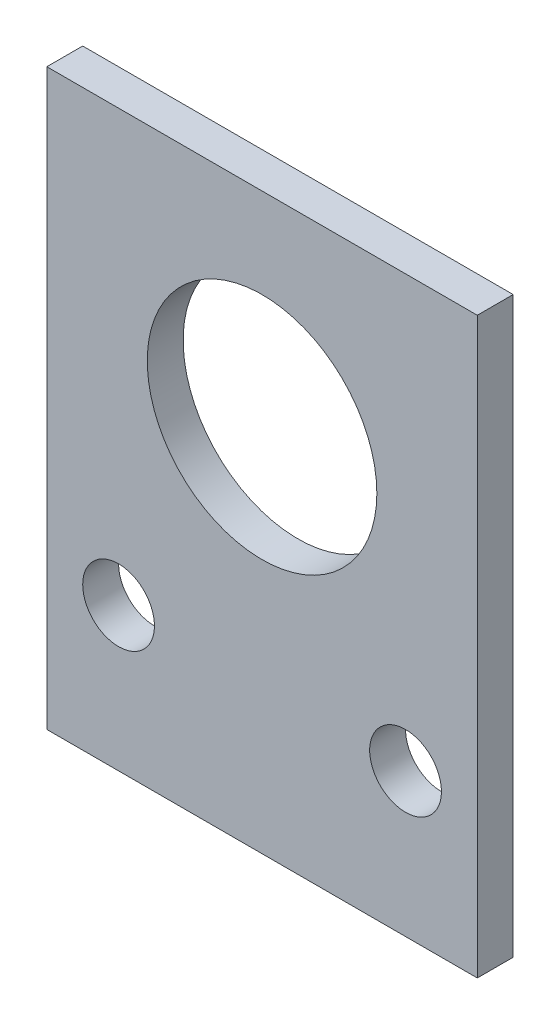
ISO-10303-21;
HEADER;
FILE_DESCRIPTION(('STEP AP214'),'2;1');
FILE_NAME('part.step','',(''),(''),'','','');
FILE_SCHEMA(('AUTOMOTIVE_DESIGN { 1 0 10303 214 1 1 1 1 }'));
ENDSEC;
DATA;
#1=APPLICATION_CONTEXT('core data for automotive mechanical design processes');
#2=APPLICATION_PROTOCOL_DEFINITION('international standard','automotive_design',2000,#1);
#3=PRODUCT_CONTEXT('',#1,'mechanical');
#4=PRODUCT('Part','Part','',(#3));
#5=PRODUCT_RELATED_PRODUCT_CATEGORY('part','',(#4));
#6=PRODUCT_DEFINITION_FORMATION('','',#4);
#7=PRODUCT_DEFINITION_CONTEXT('part definition',#1,'design');
#8=PRODUCT_DEFINITION('design','',#6,#7);
#9=PRODUCT_DEFINITION_SHAPE('','',#8);
#10=(LENGTH_UNIT() NAMED_UNIT(*) SI_UNIT(.MILLI.,.METRE.));
#11=(NAMED_UNIT(*) PLANE_ANGLE_UNIT() SI_UNIT($,.RADIAN.));
#12=(NAMED_UNIT(*) SI_UNIT($,.STERADIAN.) SOLID_ANGLE_UNIT());
#13=UNCERTAINTY_MEASURE_WITH_UNIT(LENGTH_MEASURE(1.E-05),#10,'distance_accuracy_value','');
#14=(GEOMETRIC_REPRESENTATION_CONTEXT(3) GLOBAL_UNCERTAINTY_ASSIGNED_CONTEXT((#13)) GLOBAL_UNIT_ASSIGNED_CONTEXT((#10,
#11,#12)) REPRESENTATION_CONTEXT('',''));
#15=CARTESIAN_POINT('',(0.,0.,0.));
#16=DIRECTION('',(0.,0.,1.));
#17=DIRECTION('',(1.,0.,0.));
#18=AXIS2_PLACEMENT_3D('',#15,#16,#17);
#19=CARTESIAN_POINT('',(0.,0.,5.));
#20=DIRECTION('',(0.,0.,1.));
#21=DIRECTION('',(1.,0.,0.));
#22=AXIS2_PLACEMENT_3D('',#19,#20,#21);
#23=PLANE('',#22);
#24=CARTESIAN_POINT('',(20.,-20.,5.));
#25=DIRECTION('',(0.,0.,1.));
#26=DIRECTION('',(1.,0.,0.));
#27=AXIS2_PLACEMENT_3D('',#24,#25,#26);
#28=CIRCLE('',#27,5.);
#29=CARTESIAN_POINT('',(25.,-20.,5.));
#30=VERTEX_POINT('',#29);
#31=EDGE_CURVE('E117',#30,#30,#28,.T.);
#32=ORIENTED_EDGE('',*,*,#31,.F.);
#33=EDGE_LOOP('',(#32));
#34=FACE_BOUND('',#33,.T.);
#35=DIRECTION('',(0.,1.,0.));
#36=VECTOR('',#35,1.);
#37=CARTESIAN_POINT('',(30.,40.,5.));
#38=LINE('',#37,#36);
#39=CARTESIAN_POINT('',(30.,-40.,5.));
#40=VERTEX_POINT('',#39);
#41=CARTESIAN_POINT('',(30.,40.,5.));
#42=VERTEX_POINT('',#41);
#43=EDGE_CURVE('E87',#40,#42,#38,.T.);
#44=ORIENTED_EDGE('',*,*,#43,.T.);
#45=DIRECTION('',(-1.,0.,0.));
#46=VECTOR('',#45,1.);
#47=CARTESIAN_POINT('',(-30.,40.,5.));
#48=LINE('',#47,#46);
#49=CARTESIAN_POINT('',(-30.,40.,5.));
#50=VERTEX_POINT('',#49);
#51=EDGE_CURVE('E82',#42,#50,#48,.T.);
#52=ORIENTED_EDGE('',*,*,#51,.T.);
#53=DIRECTION('',(0.,-1.,0.));
#54=VECTOR('',#53,1.);
#55=CARTESIAN_POINT('',(-30.,40.,5.));
#56=LINE('',#55,#54);
#57=CARTESIAN_POINT('',(-30.,-40.,5.));
#58=VERTEX_POINT('',#57);
#59=EDGE_CURVE('E85',#50,#58,#56,.T.);
#60=ORIENTED_EDGE('',*,*,#59,.T.);
#61=DIRECTION('',(1.,0.,0.));
#62=VECTOR('',#61,1.);
#63=CARTESIAN_POINT('',(-30.,-40.,5.));
#64=LINE('',#63,#62);
#65=EDGE_CURVE('E52',#58,#40,#64,.T.);
#66=ORIENTED_EDGE('',*,*,#65,.T.);
#67=EDGE_LOOP('',(#44,#52,#60,#66));
#68=FACE_BOUND('',#67,.T.);
#69=CARTESIAN_POINT('',(0.,11.5,5.));
#70=DIRECTION('',(0.,0.,1.));
#71=DIRECTION('',(1.,0.,0.));
#72=AXIS2_PLACEMENT_3D('',#69,#70,#71);
#73=CIRCLE('',#72,16.);
#74=CARTESIAN_POINT('',(16.,11.5,5.));
#75=VERTEX_POINT('',#74);
#76=EDGE_CURVE('E102',#75,#75,#73,.T.);
#77=ORIENTED_EDGE('',*,*,#76,.F.);
#78=EDGE_LOOP('',(#77));
#79=FACE_BOUND('',#78,.T.);
#80=CARTESIAN_POINT('',(-20.,-20.,5.));
#81=DIRECTION('',(0.,0.,1.));
#82=DIRECTION('',(-1.,0.,0.));
#83=AXIS2_PLACEMENT_3D('',#80,#81,#82);
#84=CIRCLE('',#83,5.);
#85=CARTESIAN_POINT('',(-25.,-20.,5.));
#86=VERTEX_POINT('',#85);
#87=EDGE_CURVE('E123',#86,#86,#84,.T.);
#88=ORIENTED_EDGE('',*,*,#87,.F.);
#89=EDGE_LOOP('',(#88));
#90=FACE_BOUND('',#89,.T.);
#91=ADVANCED_FACE('F35',(#34,#68,#79,#90),#23,.T.);
#92=CARTESIAN_POINT('',(0.,0.,0.));
#93=DIRECTION('',(0.,0.,1.));
#94=DIRECTION('',(1.,0.,0.));
#95=AXIS2_PLACEMENT_3D('',#92,#93,#94);
#96=PLANE('',#95);
#97=DIRECTION('',(0.,1.,0.));
#98=VECTOR('',#97,1.);
#99=CARTESIAN_POINT('',(30.,40.,0.));
#100=LINE('',#99,#98);
#101=CARTESIAN_POINT('',(30.,-40.,0.));
#102=VERTEX_POINT('',#101);
#103=CARTESIAN_POINT('',(30.,40.,0.));
#104=VERTEX_POINT('',#103);
#105=EDGE_CURVE('E99',#102,#104,#100,.T.);
#106=ORIENTED_EDGE('',*,*,#105,.F.);
#107=DIRECTION('',(1.,0.,0.));
#108=VECTOR('',#107,1.);
#109=CARTESIAN_POINT('',(-30.,-40.,0.));
#110=LINE('',#109,#108);
#111=CARTESIAN_POINT('',(-30.,-40.,0.));
#112=VERTEX_POINT('',#111);
#113=EDGE_CURVE('E75',#112,#102,#110,.T.);
#114=ORIENTED_EDGE('',*,*,#113,.F.);
#115=DIRECTION('',(0.,-1.,0.));
#116=VECTOR('',#115,1.);
#117=CARTESIAN_POINT('',(-30.,40.,0.));
#118=LINE('',#117,#116);
#119=CARTESIAN_POINT('',(-30.,40.,0.));
#120=VERTEX_POINT('',#119);
#121=EDGE_CURVE('E69',#120,#112,#118,.T.);
#122=ORIENTED_EDGE('',*,*,#121,.F.);
#123=DIRECTION('',(-1.,0.,0.));
#124=VECTOR('',#123,1.);
#125=CARTESIAN_POINT('',(-30.,40.,0.));
#126=LINE('',#125,#124);
#127=EDGE_CURVE('E91',#104,#120,#126,.T.);
#128=ORIENTED_EDGE('',*,*,#127,.F.);
#129=EDGE_LOOP('',(#106,#114,#122,#128));
#130=FACE_BOUND('',#129,.T.);
#131=CARTESIAN_POINT('',(0.,11.5,0.));
#132=DIRECTION('',(0.,0.,1.));
#133=DIRECTION('',(1.,0.,0.));
#134=AXIS2_PLACEMENT_3D('',#131,#132,#133);
#135=CIRCLE('',#134,16.);
#136=CARTESIAN_POINT('',(16.,11.5,0.));
#137=VERTEX_POINT('',#136);
#138=EDGE_CURVE('E114',#137,#137,#135,.T.);
#139=ORIENTED_EDGE('',*,*,#138,.T.);
#140=EDGE_LOOP('',(#139));
#141=FACE_BOUND('',#140,.T.);
#142=CARTESIAN_POINT('',(20.,-20.,0.));
#143=DIRECTION('',(0.,0.,1.));
#144=DIRECTION('',(1.,0.,0.));
#145=AXIS2_PLACEMENT_3D('',#142,#143,#144);
#146=CIRCLE('',#145,5.);
#147=CARTESIAN_POINT('',(25.,-20.,0.));
#148=VERTEX_POINT('',#147);
#149=EDGE_CURVE('E120',#148,#148,#146,.T.);
#150=ORIENTED_EDGE('',*,*,#149,.T.);
#151=EDGE_LOOP('',(#150));
#152=FACE_BOUND('',#151,.T.);
#153=CARTESIAN_POINT('',(-20.,-20.,0.));
#154=DIRECTION('',(0.,0.,1.));
#155=DIRECTION('',(-1.,0.,0.));
#156=AXIS2_PLACEMENT_3D('',#153,#154,#155);
#157=CIRCLE('',#156,5.);
#158=CARTESIAN_POINT('',(-25.,-20.,0.));
#159=VERTEX_POINT('',#158);
#160=EDGE_CURVE('E126',#159,#159,#157,.T.);
#161=ORIENTED_EDGE('',*,*,#160,.T.);
#162=EDGE_LOOP('',(#161));
#163=FACE_BOUND('',#162,.T.);
#164=ADVANCED_FACE('F110',(#130,#141,#152,#163),#96,.F.);
#165=CARTESIAN_POINT('',(30.,40.,5.));
#166=DIRECTION('',(-1.,0.,0.));
#167=DIRECTION('',(0.,-1.,0.));
#168=AXIS2_PLACEMENT_3D('',#165,#166,#167);
#169=PLANE('',#168);
#170=ORIENTED_EDGE('',*,*,#105,.T.);
#171=DIRECTION('',(0.,0.,-1.));
#172=VECTOR('',#171,1.);
#173=CARTESIAN_POINT('',(30.,40.,5.));
#174=LINE('',#173,#172);
#175=EDGE_CURVE('E11',#42,#104,#174,.T.);
#176=ORIENTED_EDGE('',*,*,#175,.F.);
#177=ORIENTED_EDGE('',*,*,#43,.F.);
#178=DIRECTION('',(0.,0.,-1.));
#179=VECTOR('',#178,1.);
#180=CARTESIAN_POINT('',(30.,-40.,5.));
#181=LINE('',#180,#179);
#182=EDGE_CURVE('E95',#40,#102,#181,.T.);
#183=ORIENTED_EDGE('',*,*,#182,.T.);
#184=EDGE_LOOP('',(#170,#176,#177,#183));
#185=FACE_BOUND('',#184,.T.);
#186=ADVANCED_FACE('F37',(#185),#169,.F.);
#187=CARTESIAN_POINT('',(-30.,40.,5.));
#188=DIRECTION('',(0.,-1.,0.));
#189=DIRECTION('',(0.,0.,-1.));
#190=AXIS2_PLACEMENT_3D('',#187,#188,#189);
#191=PLANE('',#190);
#192=ORIENTED_EDGE('',*,*,#127,.T.);
#193=DIRECTION('',(0.,0.,-1.));
#194=VECTOR('',#193,1.);
#195=CARTESIAN_POINT('',(-30.,40.,5.));
#196=LINE('',#195,#194);
#197=EDGE_CURVE('E44',#50,#120,#196,.T.);
#198=ORIENTED_EDGE('',*,*,#197,.F.);
#199=ORIENTED_EDGE('',*,*,#51,.F.);
#200=ORIENTED_EDGE('',*,*,#175,.T.);
#201=EDGE_LOOP('',(#192,#198,#199,#200));
#202=FACE_BOUND('',#201,.T.);
#203=ADVANCED_FACE('F90',(#202),#191,.F.);
#204=CARTESIAN_POINT('',(-30.,40.,5.));
#205=DIRECTION('',(1.,0.,0.));
#206=DIRECTION('',(0.,1.,0.));
#207=AXIS2_PLACEMENT_3D('',#204,#205,#206);
#208=PLANE('',#207);
#209=ORIENTED_EDGE('',*,*,#121,.T.);
#210=DIRECTION('',(0.,0.,-1.));
#211=VECTOR('',#210,1.);
#212=CARTESIAN_POINT('',(-30.,-40.,5.));
#213=LINE('',#212,#211);
#214=EDGE_CURVE('E92',#58,#112,#213,.T.);
#215=ORIENTED_EDGE('',*,*,#214,.F.);
#216=ORIENTED_EDGE('',*,*,#59,.F.);
#217=ORIENTED_EDGE('',*,*,#197,.T.);
#218=EDGE_LOOP('',(#209,#215,#216,#217));
#219=FACE_BOUND('',#218,.T.);
#220=ADVANCED_FACE('F93',(#219),#208,.F.);
#221=CARTESIAN_POINT('',(-30.,-40.,5.));
#222=DIRECTION('',(0.,1.,0.));
#223=DIRECTION('',(0.,0.,1.));
#224=AXIS2_PLACEMENT_3D('',#221,#222,#223);
#225=PLANE('',#224);
#226=ORIENTED_EDGE('',*,*,#113,.T.);
#227=ORIENTED_EDGE('',*,*,#182,.F.);
#228=ORIENTED_EDGE('',*,*,#65,.F.);
#229=ORIENTED_EDGE('',*,*,#214,.T.);
#230=EDGE_LOOP('',(#226,#227,#228,#229));
#231=FACE_BOUND('',#230,.T.);
#232=ADVANCED_FACE('F107',(#231),#225,.F.);
#233=CARTESIAN_POINT('',(0.,11.5,5.));
#234=DIRECTION('',(0.,0.,-1.));
#235=DIRECTION('',(-1.,0.,0.));
#236=AXIS2_PLACEMENT_3D('',#233,#234,#235);
#237=CYLINDRICAL_SURFACE('',#236,16.);
#238=ORIENTED_EDGE('',*,*,#76,.T.);
#239=EDGE_LOOP('',(#238));
#240=FACE_BOUND('',#239,.T.);
#241=ORIENTED_EDGE('',*,*,#138,.F.);
#242=EDGE_LOOP('',(#241));
#243=FACE_BOUND('',#242,.T.);
#244=ADVANCED_FACE('F144',(#240,#243),#237,.F.);
#245=CARTESIAN_POINT('',(20.,-20.,5.));
#246=DIRECTION('',(0.,0.,-1.));
#247=DIRECTION('',(-1.,0.,0.));
#248=AXIS2_PLACEMENT_3D('',#245,#246,#247);
#249=CYLINDRICAL_SURFACE('',#248,5.);
#250=ORIENTED_EDGE('',*,*,#31,.T.);
#251=EDGE_LOOP('',(#250));
#252=FACE_BOUND('',#251,.T.);
#253=ORIENTED_EDGE('',*,*,#149,.F.);
#254=EDGE_LOOP('',(#253));
#255=FACE_BOUND('',#254,.T.);
#256=ADVANCED_FACE('F190',(#252,#255),#249,.F.);
#257=CARTESIAN_POINT('',(-20.,-20.,5.));
#258=DIRECTION('',(0.,0.,-1.));
#259=DIRECTION('',(-1.,0.,0.));
#260=AXIS2_PLACEMENT_3D('',#257,#258,#259);
#261=CYLINDRICAL_SURFACE('',#260,5.);
#262=ORIENTED_EDGE('',*,*,#87,.T.);
#263=EDGE_LOOP('',(#262));
#264=FACE_BOUND('',#263,.T.);
#265=ORIENTED_EDGE('',*,*,#160,.F.);
#266=EDGE_LOOP('',(#265));
#267=FACE_BOUND('',#266,.T.);
#268=ADVANCED_FACE('F132',(#264,#267),#261,.F.);
#269=CLOSED_SHELL('',(#91,#164,#186,#203,#220,#232,#244,#256,#268));
#270=MANIFOLD_SOLID_BREP('B2',#269);
#271=ADVANCED_BREP_SHAPE_REPRESENTATION('',(#18,#270),#14);
#272=SHAPE_DEFINITION_REPRESENTATION(#9,#271);
ENDSEC;
END-ISO-10303-21;
